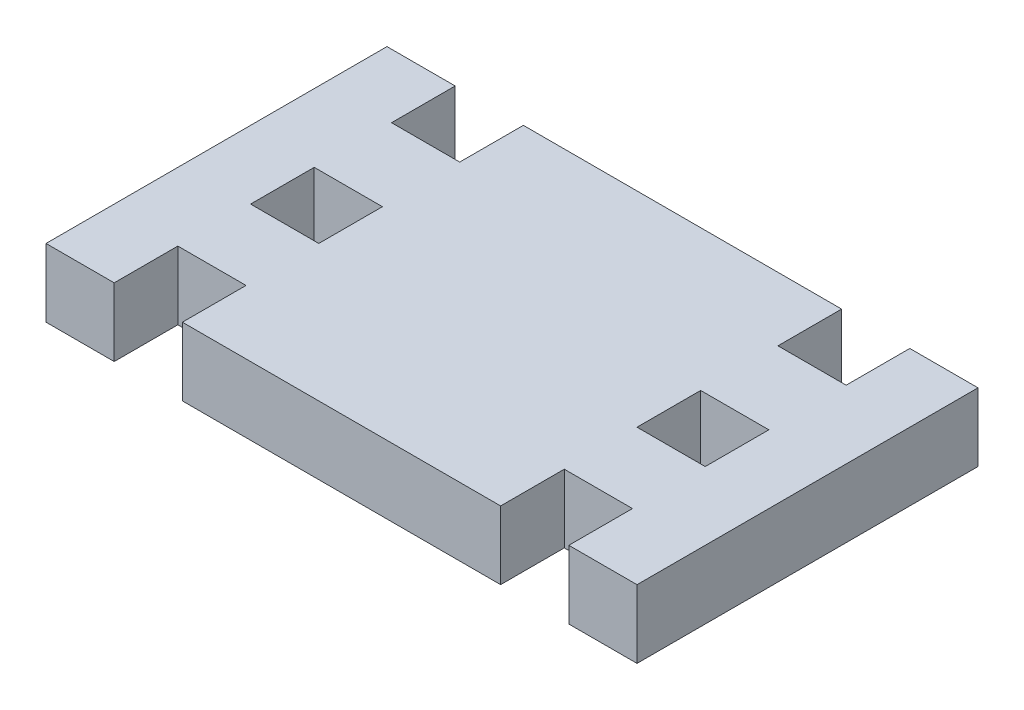
ISO-10303-21;
HEADER;
FILE_DESCRIPTION(('STEP AP214'),'2;1');
FILE_NAME('part.step','',(''),(''),'','','');
FILE_SCHEMA(('AUTOMOTIVE_DESIGN { 1 0 10303 214 1 1 1 1 }'));
ENDSEC;
DATA;
#1=APPLICATION_CONTEXT('core data for automotive mechanical design processes');
#2=APPLICATION_PROTOCOL_DEFINITION('international standard','automotive_design',2000,#1);
#3=PRODUCT_CONTEXT('',#1,'mechanical');
#4=PRODUCT('Part','Part','',(#3));
#5=PRODUCT_RELATED_PRODUCT_CATEGORY('part','',(#4));
#6=PRODUCT_DEFINITION_FORMATION('','',#4);
#7=PRODUCT_DEFINITION_CONTEXT('part definition',#1,'design');
#8=PRODUCT_DEFINITION('design','',#6,#7);
#9=PRODUCT_DEFINITION_SHAPE('','',#8);
#10=(LENGTH_UNIT() NAMED_UNIT(*) SI_UNIT(.MILLI.,.METRE.));
#11=(NAMED_UNIT(*) PLANE_ANGLE_UNIT() SI_UNIT($,.RADIAN.));
#12=(NAMED_UNIT(*) SI_UNIT($,.STERADIAN.) SOLID_ANGLE_UNIT());
#13=UNCERTAINTY_MEASURE_WITH_UNIT(LENGTH_MEASURE(1.E-05),#10,'distance_accuracy_value','');
#14=(GEOMETRIC_REPRESENTATION_CONTEXT(3) GLOBAL_UNCERTAINTY_ASSIGNED_CONTEXT((#13)) GLOBAL_UNIT_ASSIGNED_CONTEXT((#10,
#11,#12)) REPRESENTATION_CONTEXT('',''));
#15=CARTESIAN_POINT('',(0.,0.,0.));
#16=DIRECTION('',(0.,0.,1.));
#17=DIRECTION('',(1.,0.,0.));
#18=AXIS2_PLACEMENT_3D('',#15,#16,#17);
#19=CARTESIAN_POINT('',(0.,3.,0.));
#20=DIRECTION('',(0.,1.,0.));
#21=DIRECTION('',(0.,0.,1.));
#22=AXIS2_PLACEMENT_3D('',#19,#20,#21);
#23=PLANE('',#22);
#24=DIRECTION('',(0.,0.,-1.));
#25=VECTOR('',#24,1.);
#26=CARTESIAN_POINT('',(-10.,3.,6.97762481767399));
#27=LINE('',#26,#25);
#28=CARTESIAN_POINT('',(-10.,3.,9.77762481767399));
#29=VERTEX_POINT('',#28);
#30=CARTESIAN_POINT('',(-10.,3.,6.97762481767399));
#31=VERTEX_POINT('',#30);
#32=EDGE_CURVE('E316',#29,#31,#27,.T.);
#33=ORIENTED_EDGE('',*,*,#32,.T.);
#34=DIRECTION('',(1.,0.,0.));
#35=VECTOR('',#34,1.);
#36=CARTESIAN_POINT('',(-10.,3.,6.97762481767399));
#37=LINE('',#36,#35);
#38=CARTESIAN_POINT('',(-7.,3.,6.97762481767399));
#39=VERTEX_POINT('',#38);
#40=EDGE_CURVE('E320',#31,#39,#37,.T.);
#41=ORIENTED_EDGE('',*,*,#40,.T.);
#42=DIRECTION('',(0.,0.,1.));
#43=VECTOR('',#42,1.);
#44=CARTESIAN_POINT('',(-7.,3.,6.97762481767399));
#45=LINE('',#44,#43);
#46=CARTESIAN_POINT('',(-7.,3.,9.77762481767399));
#47=VERTEX_POINT('',#46);
#48=EDGE_CURVE('E324',#39,#47,#45,.T.);
#49=ORIENTED_EDGE('',*,*,#48,.T.);
#50=DIRECTION('',(1.,0.,0.));
#51=VECTOR('',#50,1.);
#52=CARTESIAN_POINT('',(-7.,3.,9.77762481767399));
#53=LINE('',#52,#51);
#54=CARTESIAN_POINT('',(7.,3.,9.77762481767398));
#55=VERTEX_POINT('',#54);
#56=EDGE_CURVE('E327',#47,#55,#53,.T.);
#57=ORIENTED_EDGE('',*,*,#56,.T.);
#58=DIRECTION('',(0.,0.,-1.));
#59=VECTOR('',#58,1.);
#60=CARTESIAN_POINT('',(7.,3.,6.97762481767398));
#61=LINE('',#60,#59);
#62=CARTESIAN_POINT('',(7.,3.,6.97762481767398));
#63=VERTEX_POINT('',#62);
#64=EDGE_CURVE('E330',#55,#63,#61,.T.);
#65=ORIENTED_EDGE('',*,*,#64,.T.);
#66=DIRECTION('',(1.,0.,0.));
#67=VECTOR('',#66,1.);
#68=CARTESIAN_POINT('',(10.,3.,6.97762481767398));
#69=LINE('',#68,#67);
#70=CARTESIAN_POINT('',(10.,3.,6.97762481767398));
#71=VERTEX_POINT('',#70);
#72=EDGE_CURVE('E333',#63,#71,#69,.T.);
#73=ORIENTED_EDGE('',*,*,#72,.T.);
#74=DIRECTION('',(0.,0.,1.));
#75=VECTOR('',#74,1.);
#76=CARTESIAN_POINT('',(10.,3.,6.97762481767398));
#77=LINE('',#76,#75);
#78=CARTESIAN_POINT('',(10.,3.,9.77762481767399));
#79=VERTEX_POINT('',#78);
#80=EDGE_CURVE('E336',#71,#79,#77,.T.);
#81=ORIENTED_EDGE('',*,*,#80,.T.);
#82=DIRECTION('',(1.,0.,0.));
#83=VECTOR('',#82,1.);
#84=CARTESIAN_POINT('',(10.,3.,9.77762481767399));
#85=LINE('',#84,#83);
#86=CARTESIAN_POINT('',(13.,3.,9.77762481767399));
#87=VERTEX_POINT('',#86);
#88=EDGE_CURVE('E339',#79,#87,#85,.T.);
#89=ORIENTED_EDGE('',*,*,#88,.T.);
#90=DIRECTION('',(0.,0.,-1.));
#91=VECTOR('',#90,1.);
#92=CARTESIAN_POINT('',(13.,3.,-5.22237518232601));
#93=LINE('',#92,#91);
#94=CARTESIAN_POINT('',(13.,3.,-5.22237518232601));
#95=VERTEX_POINT('',#94);
#96=EDGE_CURVE('E342',#87,#95,#93,.T.);
#97=ORIENTED_EDGE('',*,*,#96,.T.);
#98=DIRECTION('',(-1.,0.,0.));
#99=VECTOR('',#98,1.);
#100=CARTESIAN_POINT('',(10.,3.,-5.22237518232601));
#101=LINE('',#100,#99);
#102=CARTESIAN_POINT('',(10.,3.,-5.22237518232601));
#103=VERTEX_POINT('',#102);
#104=EDGE_CURVE('E345',#95,#103,#101,.T.);
#105=ORIENTED_EDGE('',*,*,#104,.T.);
#106=DIRECTION('',(0.,0.,1.));
#107=VECTOR('',#106,1.);
#108=CARTESIAN_POINT('',(10.,3.,-5.22237518232601));
#109=LINE('',#108,#107);
#110=CARTESIAN_POINT('',(10.,3.,-2.42237518232601));
#111=VERTEX_POINT('',#110);
#112=EDGE_CURVE('E348',#103,#111,#109,.T.);
#113=ORIENTED_EDGE('',*,*,#112,.T.);
#114=DIRECTION('',(-1.,0.,0.));
#115=VECTOR('',#114,1.);
#116=CARTESIAN_POINT('',(10.,3.,-2.42237518232601));
#117=LINE('',#116,#115);
#118=CARTESIAN_POINT('',(6.99999999999999,3.,-2.42237518232601));
#119=VERTEX_POINT('',#118);
#120=EDGE_CURVE('E351',#111,#119,#117,.T.);
#121=ORIENTED_EDGE('',*,*,#120,.T.);
#122=DIRECTION('',(0.,0.,-1.));
#123=VECTOR('',#122,1.);
#124=CARTESIAN_POINT('',(6.99999999999999,3.,-5.22237518232601));
#125=LINE('',#124,#123);
#126=CARTESIAN_POINT('',(6.99999999999999,3.,-5.22237518232601));
#127=VERTEX_POINT('',#126);
#128=EDGE_CURVE('E354',#119,#127,#125,.T.);
#129=ORIENTED_EDGE('',*,*,#128,.T.);
#130=DIRECTION('',(-1.,0.,0.));
#131=VECTOR('',#130,1.);
#132=CARTESIAN_POINT('',(-6.99999999999999,3.,-5.22237518232601));
#133=LINE('',#132,#131);
#134=CARTESIAN_POINT('',(-6.99999999999999,3.,-5.22237518232601));
#135=VERTEX_POINT('',#134);
#136=EDGE_CURVE('E357',#127,#135,#133,.T.);
#137=ORIENTED_EDGE('',*,*,#136,.T.);
#138=DIRECTION('',(0.,0.,1.));
#139=VECTOR('',#138,1.);
#140=CARTESIAN_POINT('',(-6.99999999999999,3.,-5.22237518232601));
#141=LINE('',#140,#139);
#142=CARTESIAN_POINT('',(-6.99999999999999,3.,-2.42237518232601));
#143=VERTEX_POINT('',#142);
#144=EDGE_CURVE('E360',#135,#143,#141,.T.);
#145=ORIENTED_EDGE('',*,*,#144,.T.);
#146=DIRECTION('',(-1.,0.,0.));
#147=VECTOR('',#146,1.);
#148=CARTESIAN_POINT('',(-10.,3.,-2.42237518232601));
#149=LINE('',#148,#147);
#150=CARTESIAN_POINT('',(-10.,3.,-2.42237518232601));
#151=VERTEX_POINT('',#150);
#152=EDGE_CURVE('E363',#143,#151,#149,.T.);
#153=ORIENTED_EDGE('',*,*,#152,.T.);
#154=DIRECTION('',(0.,0.,-1.));
#155=VECTOR('',#154,1.);
#156=CARTESIAN_POINT('',(-10.,3.,-5.22237518232601));
#157=LINE('',#156,#155);
#158=CARTESIAN_POINT('',(-10.,3.,-5.22237518232601));
#159=VERTEX_POINT('',#158);
#160=EDGE_CURVE('E366',#151,#159,#157,.T.);
#161=ORIENTED_EDGE('',*,*,#160,.T.);
#162=DIRECTION('',(-1.,0.,0.));
#163=VECTOR('',#162,1.);
#164=CARTESIAN_POINT('',(-13.,3.,-5.22237518232601));
#165=LINE('',#164,#163);
#166=CARTESIAN_POINT('',(-13.,3.,-5.22237518232601));
#167=VERTEX_POINT('',#166);
#168=EDGE_CURVE('E369',#159,#167,#165,.T.);
#169=ORIENTED_EDGE('',*,*,#168,.T.);
#170=DIRECTION('',(0.,0.,1.));
#171=VECTOR('',#170,1.);
#172=CARTESIAN_POINT('',(-13.,3.,-5.22237518232601));
#173=LINE('',#172,#171);
#174=CARTESIAN_POINT('',(-13.,3.,9.77762481767399));
#175=VERTEX_POINT('',#174);
#176=EDGE_CURVE('E372',#167,#175,#173,.T.);
#177=ORIENTED_EDGE('',*,*,#176,.T.);
#178=DIRECTION('',(1.,0.,0.));
#179=VECTOR('',#178,1.);
#180=CARTESIAN_POINT('',(-13.,3.,9.77762481767399));
#181=LINE('',#180,#179);
#182=EDGE_CURVE('E375',#175,#29,#181,.T.);
#183=ORIENTED_EDGE('',*,*,#182,.T.);
#184=EDGE_LOOP('',(#33,#41,#49,#57,#65,#73,#81,#89,#97,#105,#113,#121,#129,#137,#145,#153,#161,
#169,#177,#183));
#185=FACE_BOUND('',#184,.T.);
#186=DIRECTION('',(1.,0.,0.));
#187=VECTOR('',#186,1.);
#188=CARTESIAN_POINT('',(-10.,3.,3.77762481767399));
#189=LINE('',#188,#187);
#190=CARTESIAN_POINT('',(-10.,3.,3.77762481767399));
#191=VERTEX_POINT('',#190);
#192=CARTESIAN_POINT('',(-7.,3.,3.77762481767399));
#193=VERTEX_POINT('',#192);
#194=EDGE_CURVE('E276',#191,#193,#189,.T.);
#195=ORIENTED_EDGE('',*,*,#194,.F.);
#196=DIRECTION('',(0.,0.,1.));
#197=VECTOR('',#196,1.);
#198=CARTESIAN_POINT('',(-10.,3.,0.977624817673989));
#199=LINE('',#198,#197);
#200=CARTESIAN_POINT('',(-10.,3.,0.977624817673989));
#201=VERTEX_POINT('',#200);
#202=EDGE_CURVE('E273',#201,#191,#199,.T.);
#203=ORIENTED_EDGE('',*,*,#202,.F.);
#204=DIRECTION('',(-1.,0.,0.));
#205=VECTOR('',#204,1.);
#206=CARTESIAN_POINT('',(-10.,3.,0.977624817673989));
#207=LINE('',#206,#205);
#208=CARTESIAN_POINT('',(-7.,3.,0.977624817673989));
#209=VERTEX_POINT('',#208);
#210=EDGE_CURVE('E284',#209,#201,#207,.T.);
#211=ORIENTED_EDGE('',*,*,#210,.F.);
#212=DIRECTION('',(0.,0.,-1.));
#213=VECTOR('',#212,1.);
#214=CARTESIAN_POINT('',(-7.,3.,0.977624817673989));
#215=LINE('',#214,#213);
#216=EDGE_CURVE('E280',#193,#209,#215,.T.);
#217=ORIENTED_EDGE('',*,*,#216,.F.);
#218=EDGE_LOOP('',(#195,#203,#211,#217));
#219=FACE_BOUND('',#218,.T.);
#220=DIRECTION('',(0.,0.,1.));
#221=VECTOR('',#220,1.);
#222=CARTESIAN_POINT('',(7.,3.,0.977624817673987));
#223=LINE('',#222,#221);
#224=CARTESIAN_POINT('',(7.,3.,0.977624817673987));
#225=VERTEX_POINT('',#224);
#226=CARTESIAN_POINT('',(7.,3.,3.77762481767399));
#227=VERTEX_POINT('',#226);
#228=EDGE_CURVE('E234',#225,#227,#223,.T.);
#229=ORIENTED_EDGE('',*,*,#228,.F.);
#230=DIRECTION('',(-1.,0.,0.));
#231=VECTOR('',#230,1.);
#232=CARTESIAN_POINT('',(10.,3.,0.977624817673987));
#233=LINE('',#232,#231);
#234=CARTESIAN_POINT('',(10.,3.,0.977624817673987));
#235=VERTEX_POINT('',#234);
#236=EDGE_CURVE('E225',#235,#225,#233,.T.);
#237=ORIENTED_EDGE('',*,*,#236,.F.);
#238=DIRECTION('',(0.,0.,-1.));
#239=VECTOR('',#238,1.);
#240=CARTESIAN_POINT('',(10.,3.,0.977624817673987));
#241=LINE('',#240,#239);
#242=CARTESIAN_POINT('',(10.,3.,3.77762481767399));
#243=VERTEX_POINT('',#242);
#244=EDGE_CURVE('E251',#243,#235,#241,.T.);
#245=ORIENTED_EDGE('',*,*,#244,.F.);
#246=DIRECTION('',(1.,0.,0.));
#247=VECTOR('',#246,1.);
#248=CARTESIAN_POINT('',(10.,3.,3.77762481767399));
#249=LINE('',#248,#247);
#250=EDGE_CURVE('E247',#227,#243,#249,.T.);
#251=ORIENTED_EDGE('',*,*,#250,.F.);
#252=EDGE_LOOP('',(#229,#237,#245,#251));
#253=FACE_BOUND('',#252,.T.);
#254=ADVANCED_FACE('F39',(#185,#219,#253),#23,.T.);
#255=CARTESIAN_POINT('',(0.,0.,0.));
#256=DIRECTION('',(0.,1.,0.));
#257=DIRECTION('',(0.,0.,1.));
#258=AXIS2_PLACEMENT_3D('',#255,#256,#257);
#259=PLANE('',#258);
#260=DIRECTION('',(0.,0.,1.));
#261=VECTOR('',#260,1.);
#262=CARTESIAN_POINT('',(-10.,0.,0.977624817673989));
#263=LINE('',#262,#261);
#264=CARTESIAN_POINT('',(-10.,0.,0.977624817673989));
#265=VERTEX_POINT('',#264);
#266=CARTESIAN_POINT('',(-10.,0.,3.77762481767399));
#267=VERTEX_POINT('',#266);
#268=EDGE_CURVE('E243',#265,#267,#263,.T.);
#269=ORIENTED_EDGE('',*,*,#268,.T.);
#270=DIRECTION('',(1.,0.,0.));
#271=VECTOR('',#270,1.);
#272=CARTESIAN_POINT('',(-10.,0.,3.77762481767399));
#273=LINE('',#272,#271);
#274=CARTESIAN_POINT('',(-7.,0.,3.77762481767399));
#275=VERTEX_POINT('',#274);
#276=EDGE_CURVE('E291',#267,#275,#273,.T.);
#277=ORIENTED_EDGE('',*,*,#276,.T.);
#278=DIRECTION('',(0.,0.,-1.));
#279=VECTOR('',#278,1.);
#280=CARTESIAN_POINT('',(-7.,0.,0.977624817673989));
#281=LINE('',#280,#279);
#282=CARTESIAN_POINT('',(-7.,0.,0.977624817673989));
#283=VERTEX_POINT('',#282);
#284=EDGE_CURVE('E295',#275,#283,#281,.T.);
#285=ORIENTED_EDGE('',*,*,#284,.T.);
#286=DIRECTION('',(-1.,0.,0.));
#287=VECTOR('',#286,1.);
#288=CARTESIAN_POINT('',(-10.,0.,0.977624817673989));
#289=LINE('',#288,#287);
#290=EDGE_CURVE('E277',#283,#265,#289,.T.);
#291=ORIENTED_EDGE('',*,*,#290,.T.);
#292=EDGE_LOOP('',(#269,#277,#285,#291));
#293=FACE_BOUND('',#292,.T.);
#294=DIRECTION('',(0.,0.,-1.));
#295=VECTOR('',#294,1.);
#296=CARTESIAN_POINT('',(-10.,0.,6.97762481767399));
#297=LINE('',#296,#295);
#298=CARTESIAN_POINT('',(-10.,0.,9.77762481767399));
#299=VERTEX_POINT('',#298);
#300=CARTESIAN_POINT('',(-10.,0.,6.97762481767399));
#301=VERTEX_POINT('',#300);
#302=EDGE_CURVE('E315',#299,#301,#297,.T.);
#303=ORIENTED_EDGE('',*,*,#302,.F.);
#304=DIRECTION('',(1.,0.,0.));
#305=VECTOR('',#304,1.);
#306=CARTESIAN_POINT('',(-13.,0.,9.77762481767399));
#307=LINE('',#306,#305);
#308=CARTESIAN_POINT('',(-13.,0.,9.77762481767399));
#309=VERTEX_POINT('',#308);
#310=EDGE_CURVE('E321',#309,#299,#307,.T.);
#311=ORIENTED_EDGE('',*,*,#310,.F.);
#312=DIRECTION('',(0.,0.,1.));
#313=VECTOR('',#312,1.);
#314=CARTESIAN_POINT('',(-13.,0.,-5.22237518232601));
#315=LINE('',#314,#313);
#316=CARTESIAN_POINT('',(-13.,0.,-5.22237518232601));
#317=VERTEX_POINT('',#316);
#318=EDGE_CURVE('E433',#317,#309,#315,.T.);
#319=ORIENTED_EDGE('',*,*,#318,.F.);
#320=DIRECTION('',(-1.,0.,0.));
#321=VECTOR('',#320,1.);
#322=CARTESIAN_POINT('',(-13.,0.,-5.22237518232601));
#323=LINE('',#322,#321);
#324=CARTESIAN_POINT('',(-10.,0.,-5.22237518232601));
#325=VERTEX_POINT('',#324);
#326=EDGE_CURVE('E430',#325,#317,#323,.T.);
#327=ORIENTED_EDGE('',*,*,#326,.F.);
#328=DIRECTION('',(0.,0.,-1.));
#329=VECTOR('',#328,1.);
#330=CARTESIAN_POINT('',(-10.,0.,-5.22237518232601));
#331=LINE('',#330,#329);
#332=CARTESIAN_POINT('',(-10.,0.,-2.42237518232601));
#333=VERTEX_POINT('',#332);
#334=EDGE_CURVE('E427',#333,#325,#331,.T.);
#335=ORIENTED_EDGE('',*,*,#334,.F.);
#336=DIRECTION('',(-1.,0.,0.));
#337=VECTOR('',#336,1.);
#338=CARTESIAN_POINT('',(-10.,0.,-2.42237518232601));
#339=LINE('',#338,#337);
#340=CARTESIAN_POINT('',(-6.99999999999999,0.,-2.42237518232601));
#341=VERTEX_POINT('',#340);
#342=EDGE_CURVE('E424',#341,#333,#339,.T.);
#343=ORIENTED_EDGE('',*,*,#342,.F.);
#344=DIRECTION('',(0.,0.,1.));
#345=VECTOR('',#344,1.);
#346=CARTESIAN_POINT('',(-6.99999999999999,0.,-5.22237518232601));
#347=LINE('',#346,#345);
#348=CARTESIAN_POINT('',(-6.99999999999999,0.,-5.22237518232601));
#349=VERTEX_POINT('',#348);
#350=EDGE_CURVE('E421',#349,#341,#347,.T.);
#351=ORIENTED_EDGE('',*,*,#350,.F.);
#352=DIRECTION('',(-1.,0.,0.));
#353=VECTOR('',#352,1.);
#354=CARTESIAN_POINT('',(-6.99999999999999,0.,-5.22237518232601));
#355=LINE('',#354,#353);
#356=CARTESIAN_POINT('',(6.99999999999999,0.,-5.22237518232601));
#357=VERTEX_POINT('',#356);
#358=EDGE_CURVE('E418',#357,#349,#355,.T.);
#359=ORIENTED_EDGE('',*,*,#358,.F.);
#360=DIRECTION('',(0.,0.,-1.));
#361=VECTOR('',#360,1.);
#362=CARTESIAN_POINT('',(6.99999999999999,0.,-5.22237518232601));
#363=LINE('',#362,#361);
#364=CARTESIAN_POINT('',(6.99999999999999,0.,-2.42237518232601));
#365=VERTEX_POINT('',#364);
#366=EDGE_CURVE('E415',#365,#357,#363,.T.);
#367=ORIENTED_EDGE('',*,*,#366,.F.);
#368=DIRECTION('',(-1.,0.,0.));
#369=VECTOR('',#368,1.);
#370=CARTESIAN_POINT('',(10.,0.,-2.42237518232601));
#371=LINE('',#370,#369);
#372=CARTESIAN_POINT('',(10.,0.,-2.42237518232601));
#373=VERTEX_POINT('',#372);
#374=EDGE_CURVE('E412',#373,#365,#371,.T.);
#375=ORIENTED_EDGE('',*,*,#374,.F.);
#376=DIRECTION('',(0.,0.,1.));
#377=VECTOR('',#376,1.);
#378=CARTESIAN_POINT('',(10.,0.,-5.22237518232601));
#379=LINE('',#378,#377);
#380=CARTESIAN_POINT('',(10.,0.,-5.22237518232601));
#381=VERTEX_POINT('',#380);
#382=EDGE_CURVE('E409',#381,#373,#379,.T.);
#383=ORIENTED_EDGE('',*,*,#382,.F.);
#384=DIRECTION('',(-1.,0.,0.));
#385=VECTOR('',#384,1.);
#386=CARTESIAN_POINT('',(10.,0.,-5.22237518232601));
#387=LINE('',#386,#385);
#388=CARTESIAN_POINT('',(13.,0.,-5.22237518232601));
#389=VERTEX_POINT('',#388);
#390=EDGE_CURVE('E406',#389,#381,#387,.T.);
#391=ORIENTED_EDGE('',*,*,#390,.F.);
#392=DIRECTION('',(0.,0.,-1.));
#393=VECTOR('',#392,1.);
#394=CARTESIAN_POINT('',(13.,0.,-5.22237518232601));
#395=LINE('',#394,#393);
#396=CARTESIAN_POINT('',(13.,0.,9.77762481767399));
#397=VERTEX_POINT('',#396);
#398=EDGE_CURVE('E403',#397,#389,#395,.T.);
#399=ORIENTED_EDGE('',*,*,#398,.F.);
#400=DIRECTION('',(1.,0.,0.));
#401=VECTOR('',#400,1.);
#402=CARTESIAN_POINT('',(10.,0.,9.77762481767399));
#403=LINE('',#402,#401);
#404=CARTESIAN_POINT('',(10.,0.,9.77762481767399));
#405=VERTEX_POINT('',#404);
#406=EDGE_CURVE('E400',#405,#397,#403,.T.);
#407=ORIENTED_EDGE('',*,*,#406,.F.);
#408=DIRECTION('',(0.,0.,1.));
#409=VECTOR('',#408,1.);
#410=CARTESIAN_POINT('',(10.,0.,6.97762481767398));
#411=LINE('',#410,#409);
#412=CARTESIAN_POINT('',(10.,0.,6.97762481767398));
#413=VERTEX_POINT('',#412);
#414=EDGE_CURVE('E397',#413,#405,#411,.T.);
#415=ORIENTED_EDGE('',*,*,#414,.F.);
#416=DIRECTION('',(1.,0.,0.));
#417=VECTOR('',#416,1.);
#418=CARTESIAN_POINT('',(10.,0.,6.97762481767398));
#419=LINE('',#418,#417);
#420=CARTESIAN_POINT('',(7.,0.,6.97762481767398));
#421=VERTEX_POINT('',#420);
#422=EDGE_CURVE('E394',#421,#413,#419,.T.);
#423=ORIENTED_EDGE('',*,*,#422,.F.);
#424=DIRECTION('',(0.,0.,-1.));
#425=VECTOR('',#424,1.);
#426=CARTESIAN_POINT('',(7.,0.,6.97762481767398));
#427=LINE('',#426,#425);
#428=CARTESIAN_POINT('',(7.,0.,9.77762481767398));
#429=VERTEX_POINT('',#428);
#430=EDGE_CURVE('E391',#429,#421,#427,.T.);
#431=ORIENTED_EDGE('',*,*,#430,.F.);
#432=DIRECTION('',(1.,0.,0.));
#433=VECTOR('',#432,1.);
#434=CARTESIAN_POINT('',(-7.,0.,9.77762481767399));
#435=LINE('',#434,#433);
#436=CARTESIAN_POINT('',(-7.,0.,9.77762481767399));
#437=VERTEX_POINT('',#436);
#438=EDGE_CURVE('E388',#437,#429,#435,.T.);
#439=ORIENTED_EDGE('',*,*,#438,.F.);
#440=DIRECTION('',(0.,0.,1.));
#441=VECTOR('',#440,1.);
#442=CARTESIAN_POINT('',(-7.,0.,6.97762481767399));
#443=LINE('',#442,#441);
#444=CARTESIAN_POINT('',(-7.,0.,6.97762481767399));
#445=VERTEX_POINT('',#444);
#446=EDGE_CURVE('E385',#445,#437,#443,.T.);
#447=ORIENTED_EDGE('',*,*,#446,.F.);
#448=DIRECTION('',(1.,0.,0.));
#449=VECTOR('',#448,1.);
#450=CARTESIAN_POINT('',(-10.,0.,6.97762481767399));
#451=LINE('',#450,#449);
#452=EDGE_CURVE('E382',#301,#445,#451,.T.);
#453=ORIENTED_EDGE('',*,*,#452,.F.);
#454=EDGE_LOOP('',(#303,#311,#319,#327,#335,#343,#351,#359,#367,#375,#383,#391,#399,#407,#415,
#423,#431,#439,#447,#453));
#455=FACE_BOUND('',#454,.T.);
#456=DIRECTION('',(-1.,0.,0.));
#457=VECTOR('',#456,1.);
#458=CARTESIAN_POINT('',(10.,0.,0.977624817673987));
#459=LINE('',#458,#457);
#460=CARTESIAN_POINT('',(10.,0.,0.977624817673987));
#461=VERTEX_POINT('',#460);
#462=CARTESIAN_POINT('',(7.,0.,0.977624817673987));
#463=VERTEX_POINT('',#462);
#464=EDGE_CURVE('E63',#461,#463,#459,.T.);
#465=ORIENTED_EDGE('',*,*,#464,.T.);
#466=DIRECTION('',(0.,0.,1.));
#467=VECTOR('',#466,1.);
#468=CARTESIAN_POINT('',(7.,0.,0.977624817673987));
#469=LINE('',#468,#467);
#470=CARTESIAN_POINT('',(7.,0.,3.77762481767399));
#471=VERTEX_POINT('',#470);
#472=EDGE_CURVE('E241',#463,#471,#469,.T.);
#473=ORIENTED_EDGE('',*,*,#472,.T.);
#474=DIRECTION('',(1.,0.,0.));
#475=VECTOR('',#474,1.);
#476=CARTESIAN_POINT('',(10.,0.,3.77762481767399));
#477=LINE('',#476,#475);
#478=CARTESIAN_POINT('',(10.,0.,3.77762481767399));
#479=VERTEX_POINT('',#478);
#480=EDGE_CURVE('E260',#471,#479,#477,.T.);
#481=ORIENTED_EDGE('',*,*,#480,.T.);
#482=DIRECTION('',(0.,0.,-1.));
#483=VECTOR('',#482,1.);
#484=CARTESIAN_POINT('',(10.,0.,0.977624817673987));
#485=LINE('',#484,#483);
#486=EDGE_CURVE('E235',#479,#461,#485,.T.);
#487=ORIENTED_EDGE('',*,*,#486,.T.);
#488=EDGE_LOOP('',(#465,#473,#481,#487));
#489=FACE_BOUND('',#488,.T.);
#490=ADVANCED_FACE('F520',(#293,#455,#489),#259,.F.);
#491=CARTESIAN_POINT('',(-10.,3.,6.97762481767399));
#492=DIRECTION('',(-1.,0.,0.));
#493=DIRECTION('',(0.,0.,1.));
#494=AXIS2_PLACEMENT_3D('',#491,#492,#493);
#495=PLANE('',#494);
#496=ORIENTED_EDGE('',*,*,#302,.T.);
#497=DIRECTION('',(0.,-1.,0.));
#498=VECTOR('',#497,1.);
#499=CARTESIAN_POINT('',(-10.,3.,6.97762481767399));
#500=LINE('',#499,#498);
#501=EDGE_CURVE('E11',#31,#301,#500,.T.);
#502=ORIENTED_EDGE('',*,*,#501,.F.);
#503=ORIENTED_EDGE('',*,*,#32,.F.);
#504=DIRECTION('',(0.,-1.,0.));
#505=VECTOR('',#504,1.);
#506=CARTESIAN_POINT('',(-10.,3.,9.77762481767399));
#507=LINE('',#506,#505);
#508=EDGE_CURVE('E378',#29,#299,#507,.T.);
#509=ORIENTED_EDGE('',*,*,#508,.T.);
#510=EDGE_LOOP('',(#496,#502,#503,#509));
#511=FACE_BOUND('',#510,.T.);
#512=ADVANCED_FACE('F41',(#511),#495,.F.);
#513=CARTESIAN_POINT('',(-10.,3.,6.97762481767399));
#514=DIRECTION('',(0.,0.,-1.));
#515=DIRECTION('',(-1.,0.,0.));
#516=AXIS2_PLACEMENT_3D('',#513,#514,#515);
#517=PLANE('',#516);
#518=ORIENTED_EDGE('',*,*,#452,.T.);
#519=DIRECTION('',(0.,-1.,0.));
#520=VECTOR('',#519,1.);
#521=CARTESIAN_POINT('',(-7.,3.,6.97762481767399));
#522=LINE('',#521,#520);
#523=EDGE_CURVE('E48',#39,#445,#522,.T.);
#524=ORIENTED_EDGE('',*,*,#523,.F.);
#525=ORIENTED_EDGE('',*,*,#40,.F.);
#526=ORIENTED_EDGE('',*,*,#501,.T.);
#527=EDGE_LOOP('',(#518,#524,#525,#526));
#528=FACE_BOUND('',#527,.T.);
#529=ADVANCED_FACE('F538',(#528),#517,.F.);
#530=CARTESIAN_POINT('',(-7.,3.,6.97762481767399));
#531=DIRECTION('',(1.,0.,0.));
#532=DIRECTION('',(0.,0.,-1.));
#533=AXIS2_PLACEMENT_3D('',#530,#531,#532);
#534=PLANE('',#533);
#535=ORIENTED_EDGE('',*,*,#446,.T.);
#536=DIRECTION('',(0.,-1.,0.));
#537=VECTOR('',#536,1.);
#538=CARTESIAN_POINT('',(-7.,3.,9.77762481767399));
#539=LINE('',#538,#537);
#540=EDGE_CURVE('E505',#47,#437,#539,.T.);
#541=ORIENTED_EDGE('',*,*,#540,.F.);
#542=ORIENTED_EDGE('',*,*,#48,.F.);
#543=ORIENTED_EDGE('',*,*,#523,.T.);
#544=EDGE_LOOP('',(#535,#541,#542,#543));
#545=FACE_BOUND('',#544,.T.);
#546=ADVANCED_FACE('F514',(#545),#534,.F.);
#547=CARTESIAN_POINT('',(-7.,3.,9.77762481767399));
#548=DIRECTION('',(0.,0.,-1.));
#549=DIRECTION('',(-1.,0.,0.));
#550=AXIS2_PLACEMENT_3D('',#547,#548,#549);
#551=PLANE('',#550);
#552=ORIENTED_EDGE('',*,*,#438,.T.);
#553=DIRECTION('',(0.,-1.,0.));
#554=VECTOR('',#553,1.);
#555=CARTESIAN_POINT('',(7.,3.,9.77762481767398));
#556=LINE('',#555,#554);
#557=EDGE_CURVE('E501',#55,#429,#556,.T.);
#558=ORIENTED_EDGE('',*,*,#557,.F.);
#559=ORIENTED_EDGE('',*,*,#56,.F.);
#560=ORIENTED_EDGE('',*,*,#540,.T.);
#561=EDGE_LOOP('',(#552,#558,#559,#560));
#562=FACE_BOUND('',#561,.T.);
#563=ADVANCED_FACE('F526',(#562),#551,.F.);
#564=CARTESIAN_POINT('',(7.,3.,6.97762481767398));
#565=DIRECTION('',(-1.,0.,0.));
#566=DIRECTION('',(0.,0.,1.));
#567=AXIS2_PLACEMENT_3D('',#564,#565,#566);
#568=PLANE('',#567);
#569=ORIENTED_EDGE('',*,*,#430,.T.);
#570=DIRECTION('',(0.,-1.,0.));
#571=VECTOR('',#570,1.);
#572=CARTESIAN_POINT('',(7.,3.,6.97762481767398));
#573=LINE('',#572,#571);
#574=EDGE_CURVE('E497',#63,#421,#573,.T.);
#575=ORIENTED_EDGE('',*,*,#574,.F.);
#576=ORIENTED_EDGE('',*,*,#64,.F.);
#577=ORIENTED_EDGE('',*,*,#557,.T.);
#578=EDGE_LOOP('',(#569,#575,#576,#577));
#579=FACE_BOUND('',#578,.T.);
#580=ADVANCED_FACE('F530',(#579),#568,.F.);
#581=CARTESIAN_POINT('',(10.,3.,6.97762481767398));
#582=DIRECTION('',(0.,0.,-1.));
#583=DIRECTION('',(-1.,0.,0.));
#584=AXIS2_PLACEMENT_3D('',#581,#582,#583);
#585=PLANE('',#584);
#586=ORIENTED_EDGE('',*,*,#422,.T.);
#587=DIRECTION('',(0.,-1.,0.));
#588=VECTOR('',#587,1.);
#589=CARTESIAN_POINT('',(10.,3.,6.97762481767398));
#590=LINE('',#589,#588);
#591=EDGE_CURVE('E493',#71,#413,#590,.T.);
#592=ORIENTED_EDGE('',*,*,#591,.F.);
#593=ORIENTED_EDGE('',*,*,#72,.F.);
#594=ORIENTED_EDGE('',*,*,#574,.T.);
#595=EDGE_LOOP('',(#586,#592,#593,#594));
#596=FACE_BOUND('',#595,.T.);
#597=ADVANCED_FACE('F611',(#596),#585,.F.);
#598=CARTESIAN_POINT('',(10.,3.,6.97762481767398));
#599=DIRECTION('',(1.,0.,0.));
#600=DIRECTION('',(0.,0.,-1.));
#601=AXIS2_PLACEMENT_3D('',#598,#599,#600);
#602=PLANE('',#601);
#603=ORIENTED_EDGE('',*,*,#414,.T.);
#604=DIRECTION('',(0.,-1.,0.));
#605=VECTOR('',#604,1.);
#606=CARTESIAN_POINT('',(10.,3.,9.77762481767399));
#607=LINE('',#606,#605);
#608=EDGE_CURVE('E489',#79,#405,#607,.T.);
#609=ORIENTED_EDGE('',*,*,#608,.F.);
#610=ORIENTED_EDGE('',*,*,#80,.F.);
#611=ORIENTED_EDGE('',*,*,#591,.T.);
#612=EDGE_LOOP('',(#603,#609,#610,#611));
#613=FACE_BOUND('',#612,.T.);
#614=ADVANCED_FACE('F609',(#613),#602,.F.);
#615=CARTESIAN_POINT('',(10.,3.,9.77762481767399));
#616=DIRECTION('',(0.,0.,-1.));
#617=DIRECTION('',(-1.,0.,0.));
#618=AXIS2_PLACEMENT_3D('',#615,#616,#617);
#619=PLANE('',#618);
#620=ORIENTED_EDGE('',*,*,#406,.T.);
#621=DIRECTION('',(0.,-1.,0.));
#622=VECTOR('',#621,1.);
#623=CARTESIAN_POINT('',(13.,3.,9.77762481767399));
#624=LINE('',#623,#622);
#625=EDGE_CURVE('E485',#87,#397,#624,.T.);
#626=ORIENTED_EDGE('',*,*,#625,.F.);
#627=ORIENTED_EDGE('',*,*,#88,.F.);
#628=ORIENTED_EDGE('',*,*,#608,.T.);
#629=EDGE_LOOP('',(#620,#626,#627,#628));
#630=FACE_BOUND('',#629,.T.);
#631=ADVANCED_FACE('F604',(#630),#619,.F.);
#632=CARTESIAN_POINT('',(13.,3.,-5.22237518232601));
#633=DIRECTION('',(-1.,0.,0.));
#634=DIRECTION('',(0.,0.,1.));
#635=AXIS2_PLACEMENT_3D('',#632,#633,#634);
#636=PLANE('',#635);
#637=ORIENTED_EDGE('',*,*,#398,.T.);
#638=DIRECTION('',(0.,-1.,0.));
#639=VECTOR('',#638,1.);
#640=CARTESIAN_POINT('',(13.,3.,-5.22237518232601));
#641=LINE('',#640,#639);
#642=EDGE_CURVE('E481',#95,#389,#641,.T.);
#643=ORIENTED_EDGE('',*,*,#642,.F.);
#644=ORIENTED_EDGE('',*,*,#96,.F.);
#645=ORIENTED_EDGE('',*,*,#625,.T.);
#646=EDGE_LOOP('',(#637,#643,#644,#645));
#647=FACE_BOUND('',#646,.T.);
#648=ADVANCED_FACE('F599',(#647),#636,.F.);
#649=CARTESIAN_POINT('',(10.,3.,-5.22237518232601));
#650=DIRECTION('',(0.,0.,1.));
#651=DIRECTION('',(1.,0.,0.));
#652=AXIS2_PLACEMENT_3D('',#649,#650,#651);
#653=PLANE('',#652);
#654=ORIENTED_EDGE('',*,*,#390,.T.);
#655=DIRECTION('',(0.,-1.,0.));
#656=VECTOR('',#655,1.);
#657=CARTESIAN_POINT('',(10.,3.,-5.22237518232601));
#658=LINE('',#657,#656);
#659=EDGE_CURVE('E477',#103,#381,#658,.T.);
#660=ORIENTED_EDGE('',*,*,#659,.F.);
#661=ORIENTED_EDGE('',*,*,#104,.F.);
#662=ORIENTED_EDGE('',*,*,#642,.T.);
#663=EDGE_LOOP('',(#654,#660,#661,#662));
#664=FACE_BOUND('',#663,.T.);
#665=ADVANCED_FACE('F595',(#664),#653,.F.);
#666=CARTESIAN_POINT('',(10.,3.,-5.22237518232601));
#667=DIRECTION('',(1.,0.,0.));
#668=DIRECTION('',(0.,0.,-1.));
#669=AXIS2_PLACEMENT_3D('',#666,#667,#668);
#670=PLANE('',#669);
#671=ORIENTED_EDGE('',*,*,#382,.T.);
#672=DIRECTION('',(0.,-1.,0.));
#673=VECTOR('',#672,1.);
#674=CARTESIAN_POINT('',(10.,3.,-2.42237518232601));
#675=LINE('',#674,#673);
#676=EDGE_CURVE('E473',#111,#373,#675,.T.);
#677=ORIENTED_EDGE('',*,*,#676,.F.);
#678=ORIENTED_EDGE('',*,*,#112,.F.);
#679=ORIENTED_EDGE('',*,*,#659,.T.);
#680=EDGE_LOOP('',(#671,#677,#678,#679));
#681=FACE_BOUND('',#680,.T.);
#682=ADVANCED_FACE('F590',(#681),#670,.F.);
#683=CARTESIAN_POINT('',(10.,3.,-2.42237518232601));
#684=DIRECTION('',(0.,0.,1.));
#685=DIRECTION('',(1.,0.,0.));
#686=AXIS2_PLACEMENT_3D('',#683,#684,#685);
#687=PLANE('',#686);
#688=ORIENTED_EDGE('',*,*,#374,.T.);
#689=DIRECTION('',(0.,-1.,0.));
#690=VECTOR('',#689,1.);
#691=CARTESIAN_POINT('',(6.99999999999999,3.,-2.42237518232601));
#692=LINE('',#691,#690);
#693=EDGE_CURVE('E469',#119,#365,#692,.T.);
#694=ORIENTED_EDGE('',*,*,#693,.F.);
#695=ORIENTED_EDGE('',*,*,#120,.F.);
#696=ORIENTED_EDGE('',*,*,#676,.T.);
#697=EDGE_LOOP('',(#688,#694,#695,#696));
#698=FACE_BOUND('',#697,.T.);
#699=ADVANCED_FACE('F584',(#698),#687,.F.);
#700=CARTESIAN_POINT('',(6.99999999999999,3.,-5.22237518232601));
#701=DIRECTION('',(-1.,0.,0.));
#702=DIRECTION('',(0.,0.,1.));
#703=AXIS2_PLACEMENT_3D('',#700,#701,#702);
#704=PLANE('',#703);
#705=ORIENTED_EDGE('',*,*,#366,.T.);
#706=DIRECTION('',(0.,-1.,0.));
#707=VECTOR('',#706,1.);
#708=CARTESIAN_POINT('',(6.99999999999999,3.,-5.22237518232601));
#709=LINE('',#708,#707);
#710=EDGE_CURVE('E465',#127,#357,#709,.T.);
#711=ORIENTED_EDGE('',*,*,#710,.F.);
#712=ORIENTED_EDGE('',*,*,#128,.F.);
#713=ORIENTED_EDGE('',*,*,#693,.T.);
#714=EDGE_LOOP('',(#705,#711,#712,#713));
#715=FACE_BOUND('',#714,.T.);
#716=ADVANCED_FACE('F580',(#715),#704,.F.);
#717=CARTESIAN_POINT('',(-6.99999999999999,3.,-5.22237518232601));
#718=DIRECTION('',(0.,0.,1.));
#719=DIRECTION('',(1.,0.,0.));
#720=AXIS2_PLACEMENT_3D('',#717,#718,#719);
#721=PLANE('',#720);
#722=ORIENTED_EDGE('',*,*,#358,.T.);
#723=DIRECTION('',(0.,-1.,0.));
#724=VECTOR('',#723,1.);
#725=CARTESIAN_POINT('',(-6.99999999999999,3.,-5.22237518232601));
#726=LINE('',#725,#724);
#727=EDGE_CURVE('E461',#135,#349,#726,.T.);
#728=ORIENTED_EDGE('',*,*,#727,.F.);
#729=ORIENTED_EDGE('',*,*,#136,.F.);
#730=ORIENTED_EDGE('',*,*,#710,.T.);
#731=EDGE_LOOP('',(#722,#728,#729,#730));
#732=FACE_BOUND('',#731,.T.);
#733=ADVANCED_FACE('F575',(#732),#721,.F.);
#734=CARTESIAN_POINT('',(-6.99999999999999,3.,-5.22237518232601));
#735=DIRECTION('',(1.,0.,0.));
#736=DIRECTION('',(0.,0.,-1.));
#737=AXIS2_PLACEMENT_3D('',#734,#735,#736);
#738=PLANE('',#737);
#739=ORIENTED_EDGE('',*,*,#350,.T.);
#740=DIRECTION('',(0.,-1.,0.));
#741=VECTOR('',#740,1.);
#742=CARTESIAN_POINT('',(-6.99999999999999,3.,-2.42237518232601));
#743=LINE('',#742,#741);
#744=EDGE_CURVE('E457',#143,#341,#743,.T.);
#745=ORIENTED_EDGE('',*,*,#744,.F.);
#746=ORIENTED_EDGE('',*,*,#144,.F.);
#747=ORIENTED_EDGE('',*,*,#727,.T.);
#748=EDGE_LOOP('',(#739,#745,#746,#747));
#749=FACE_BOUND('',#748,.T.);
#750=ADVANCED_FACE('F569',(#749),#738,.F.);
#751=CARTESIAN_POINT('',(-10.,3.,-2.42237518232601));
#752=DIRECTION('',(0.,0.,1.));
#753=DIRECTION('',(1.,0.,0.));
#754=AXIS2_PLACEMENT_3D('',#751,#752,#753);
#755=PLANE('',#754);
#756=ORIENTED_EDGE('',*,*,#342,.T.);
#757=DIRECTION('',(0.,-1.,0.));
#758=VECTOR('',#757,1.);
#759=CARTESIAN_POINT('',(-10.,3.,-2.42237518232601));
#760=LINE('',#759,#758);
#761=EDGE_CURVE('E453',#151,#333,#760,.T.);
#762=ORIENTED_EDGE('',*,*,#761,.F.);
#763=ORIENTED_EDGE('',*,*,#152,.F.);
#764=ORIENTED_EDGE('',*,*,#744,.T.);
#765=EDGE_LOOP('',(#756,#762,#763,#764));
#766=FACE_BOUND('',#765,.T.);
#767=ADVANCED_FACE('F565',(#766),#755,.F.);
#768=CARTESIAN_POINT('',(-10.,3.,-5.22237518232601));
#769=DIRECTION('',(-1.,0.,0.));
#770=DIRECTION('',(0.,0.,1.));
#771=AXIS2_PLACEMENT_3D('',#768,#769,#770);
#772=PLANE('',#771);
#773=ORIENTED_EDGE('',*,*,#334,.T.);
#774=DIRECTION('',(0.,-1.,0.));
#775=VECTOR('',#774,1.);
#776=CARTESIAN_POINT('',(-10.,3.,-5.22237518232601));
#777=LINE('',#776,#775);
#778=EDGE_CURVE('E449',#159,#325,#777,.T.);
#779=ORIENTED_EDGE('',*,*,#778,.F.);
#780=ORIENTED_EDGE('',*,*,#160,.F.);
#781=ORIENTED_EDGE('',*,*,#761,.T.);
#782=EDGE_LOOP('',(#773,#779,#780,#781));
#783=FACE_BOUND('',#782,.T.);
#784=ADVANCED_FACE('F560',(#783),#772,.F.);
#785=CARTESIAN_POINT('',(-13.,3.,-5.22237518232601));
#786=DIRECTION('',(0.,0.,1.));
#787=DIRECTION('',(1.,0.,0.));
#788=AXIS2_PLACEMENT_3D('',#785,#786,#787);
#789=PLANE('',#788);
#790=ORIENTED_EDGE('',*,*,#326,.T.);
#791=DIRECTION('',(0.,-1.,0.));
#792=VECTOR('',#791,1.);
#793=CARTESIAN_POINT('',(-13.,3.,-5.22237518232601));
#794=LINE('',#793,#792);
#795=EDGE_CURVE('E445',#167,#317,#794,.T.);
#796=ORIENTED_EDGE('',*,*,#795,.F.);
#797=ORIENTED_EDGE('',*,*,#168,.F.);
#798=ORIENTED_EDGE('',*,*,#778,.T.);
#799=EDGE_LOOP('',(#790,#796,#797,#798));
#800=FACE_BOUND('',#799,.T.);
#801=ADVANCED_FACE('F554',(#800),#789,.F.);
#802=CARTESIAN_POINT('',(-13.,3.,-5.22237518232601));
#803=DIRECTION('',(1.,0.,0.));
#804=DIRECTION('',(0.,0.,-1.));
#805=AXIS2_PLACEMENT_3D('',#802,#803,#804);
#806=PLANE('',#805);
#807=ORIENTED_EDGE('',*,*,#318,.T.);
#808=DIRECTION('',(0.,-1.,0.));
#809=VECTOR('',#808,1.);
#810=CARTESIAN_POINT('',(-13.,3.,9.77762481767399));
#811=LINE('',#810,#809);
#812=EDGE_CURVE('E441',#175,#309,#811,.T.);
#813=ORIENTED_EDGE('',*,*,#812,.F.);
#814=ORIENTED_EDGE('',*,*,#176,.F.);
#815=ORIENTED_EDGE('',*,*,#795,.T.);
#816=EDGE_LOOP('',(#807,#813,#814,#815));
#817=FACE_BOUND('',#816,.T.);
#818=ADVANCED_FACE('F550',(#817),#806,.F.);
#819=CARTESIAN_POINT('',(-13.,3.,9.77762481767399));
#820=DIRECTION('',(0.,0.,-1.));
#821=DIRECTION('',(-1.,0.,0.));
#822=AXIS2_PLACEMENT_3D('',#819,#820,#821);
#823=PLANE('',#822);
#824=ORIENTED_EDGE('',*,*,#310,.T.);
#825=ORIENTED_EDGE('',*,*,#508,.F.);
#826=ORIENTED_EDGE('',*,*,#182,.F.);
#827=ORIENTED_EDGE('',*,*,#812,.T.);
#828=EDGE_LOOP('',(#824,#825,#826,#827));
#829=FACE_BOUND('',#828,.T.);
#830=ADVANCED_FACE('F545',(#829),#823,.F.);
#831=CARTESIAN_POINT('',(-10.,3.,0.977624817673989));
#832=DIRECTION('',(1.,0.,0.));
#833=DIRECTION('',(0.,0.,-1.));
#834=AXIS2_PLACEMENT_3D('',#831,#832,#833);
#835=PLANE('',#834);
#836=ORIENTED_EDGE('',*,*,#268,.F.);
#837=DIRECTION('',(0.,-1.,0.));
#838=VECTOR('',#837,1.);
#839=CARTESIAN_POINT('',(-10.,3.,0.977624817673989));
#840=LINE('',#839,#838);
#841=EDGE_CURVE('E287',#201,#265,#840,.T.);
#842=ORIENTED_EDGE('',*,*,#841,.F.);
#843=ORIENTED_EDGE('',*,*,#202,.T.);
#844=DIRECTION('',(0.,-1.,0.));
#845=VECTOR('',#844,1.);
#846=CARTESIAN_POINT('',(-10.,3.,3.77762481767399));
#847=LINE('',#846,#845);
#848=EDGE_CURVE('E311',#191,#267,#847,.T.);
#849=ORIENTED_EDGE('',*,*,#848,.T.);
#850=EDGE_LOOP('',(#836,#842,#843,#849));
#851=FACE_BOUND('',#850,.T.);
#852=ADVANCED_FACE('F628',(#851),#835,.T.);
#853=CARTESIAN_POINT('',(-10.,3.,3.77762481767399));
#854=DIRECTION('',(0.,0.,-1.));
#855=DIRECTION('',(-1.,0.,0.));
#856=AXIS2_PLACEMENT_3D('',#853,#854,#855);
#857=PLANE('',#856);
#858=ORIENTED_EDGE('',*,*,#276,.F.);
#859=ORIENTED_EDGE('',*,*,#848,.F.);
#860=ORIENTED_EDGE('',*,*,#194,.T.);
#861=DIRECTION('',(0.,-1.,0.));
#862=VECTOR('',#861,1.);
#863=CARTESIAN_POINT('',(-7.,3.,3.77762481767399));
#864=LINE('',#863,#862);
#865=EDGE_CURVE('E308',#193,#275,#864,.T.);
#866=ORIENTED_EDGE('',*,*,#865,.T.);
#867=EDGE_LOOP('',(#858,#859,#860,#866));
#868=FACE_BOUND('',#867,.T.);
#869=ADVANCED_FACE('F714',(#868),#857,.T.);
#870=CARTESIAN_POINT('',(-7.,3.,0.977624817673989));
#871=DIRECTION('',(-1.,0.,0.));
#872=DIRECTION('',(0.,0.,1.));
#873=AXIS2_PLACEMENT_3D('',#870,#871,#872);
#874=PLANE('',#873);
#875=ORIENTED_EDGE('',*,*,#284,.F.);
#876=ORIENTED_EDGE('',*,*,#865,.F.);
#877=ORIENTED_EDGE('',*,*,#216,.T.);
#878=DIRECTION('',(0.,-1.,0.));
#879=VECTOR('',#878,1.);
#880=CARTESIAN_POINT('',(-7.,3.,0.977624817673989));
#881=LINE('',#880,#879);
#882=EDGE_CURVE('E305',#209,#283,#881,.T.);
#883=ORIENTED_EDGE('',*,*,#882,.T.);
#884=EDGE_LOOP('',(#875,#876,#877,#883));
#885=FACE_BOUND('',#884,.T.);
#886=ADVANCED_FACE('F721',(#885),#874,.T.);
#887=CARTESIAN_POINT('',(-10.,3.,0.977624817673989));
#888=DIRECTION('',(0.,0.,1.));
#889=DIRECTION('',(1.,0.,0.));
#890=AXIS2_PLACEMENT_3D('',#887,#888,#889);
#891=PLANE('',#890);
#892=ORIENTED_EDGE('',*,*,#290,.F.);
#893=ORIENTED_EDGE('',*,*,#882,.F.);
#894=ORIENTED_EDGE('',*,*,#210,.T.);
#895=ORIENTED_EDGE('',*,*,#841,.T.);
#896=EDGE_LOOP('',(#892,#893,#894,#895));
#897=FACE_BOUND('',#896,.T.);
#898=ADVANCED_FACE('F728',(#897),#891,.T.);
#899=CARTESIAN_POINT('',(10.,3.,0.977624817673987));
#900=DIRECTION('',(0.,0.,1.));
#901=DIRECTION('',(1.,0.,0.));
#902=AXIS2_PLACEMENT_3D('',#899,#900,#901);
#903=PLANE('',#902);
#904=ORIENTED_EDGE('',*,*,#464,.F.);
#905=DIRECTION('',(0.,-1.,0.));
#906=VECTOR('',#905,1.);
#907=CARTESIAN_POINT('',(10.,3.,0.977624817673987));
#908=LINE('',#907,#906);
#909=EDGE_CURVE('E229',#235,#461,#908,.T.);
#910=ORIENTED_EDGE('',*,*,#909,.F.);
#911=ORIENTED_EDGE('',*,*,#236,.T.);
#912=DIRECTION('',(0.,-1.,0.));
#913=VECTOR('',#912,1.);
#914=CARTESIAN_POINT('',(7.,3.,0.977624817673987));
#915=LINE('',#914,#913);
#916=EDGE_CURVE('E228',#225,#463,#915,.T.);
#917=ORIENTED_EDGE('',*,*,#916,.T.);
#918=EDGE_LOOP('',(#904,#910,#911,#917));
#919=FACE_BOUND('',#918,.T.);
#920=ADVANCED_FACE('F227',(#919),#903,.T.);
#921=CARTESIAN_POINT('',(7.,3.,0.977624817673987));
#922=DIRECTION('',(1.,0.,0.));
#923=DIRECTION('',(0.,0.,-1.));
#924=AXIS2_PLACEMENT_3D('',#921,#922,#923);
#925=PLANE('',#924);
#926=ORIENTED_EDGE('',*,*,#472,.F.);
#927=ORIENTED_EDGE('',*,*,#916,.F.);
#928=ORIENTED_EDGE('',*,*,#228,.T.);
#929=DIRECTION('',(0.,-1.,0.));
#930=VECTOR('',#929,1.);
#931=CARTESIAN_POINT('',(7.,3.,3.77762481767399));
#932=LINE('',#931,#930);
#933=EDGE_CURVE('E244',#227,#471,#932,.T.);
#934=ORIENTED_EDGE('',*,*,#933,.T.);
#935=EDGE_LOOP('',(#926,#927,#928,#934));
#936=FACE_BOUND('',#935,.T.);
#937=ADVANCED_FACE('F238',(#936),#925,.T.);
#938=CARTESIAN_POINT('',(10.,3.,3.77762481767399));
#939=DIRECTION('',(0.,0.,-1.));
#940=DIRECTION('',(-1.,0.,0.));
#941=AXIS2_PLACEMENT_3D('',#938,#939,#940);
#942=PLANE('',#941);
#943=ORIENTED_EDGE('',*,*,#480,.F.);
#944=ORIENTED_EDGE('',*,*,#933,.F.);
#945=ORIENTED_EDGE('',*,*,#250,.T.);
#946=DIRECTION('',(0.,-1.,0.));
#947=VECTOR('',#946,1.);
#948=CARTESIAN_POINT('',(10.,3.,3.77762481767399));
#949=LINE('',#948,#947);
#950=EDGE_CURVE('E55',#243,#479,#949,.T.);
#951=ORIENTED_EDGE('',*,*,#950,.T.);
#952=EDGE_LOOP('',(#943,#944,#945,#951));
#953=FACE_BOUND('',#952,.T.);
#954=ADVANCED_FACE('F749',(#953),#942,.T.);
#955=CARTESIAN_POINT('',(10.,3.,0.977624817673987));
#956=DIRECTION('',(-1.,0.,0.));
#957=DIRECTION('',(0.,0.,1.));
#958=AXIS2_PLACEMENT_3D('',#955,#956,#957);
#959=PLANE('',#958);
#960=ORIENTED_EDGE('',*,*,#486,.F.);
#961=ORIENTED_EDGE('',*,*,#950,.F.);
#962=ORIENTED_EDGE('',*,*,#244,.T.);
#963=ORIENTED_EDGE('',*,*,#909,.T.);
#964=EDGE_LOOP('',(#960,#961,#962,#963));
#965=FACE_BOUND('',#964,.T.);
#966=ADVANCED_FACE('F756',(#965),#959,.T.);
#967=CLOSED_SHELL('',(#254,#490,#512,#529,#546,#563,#580,#597,#614,#631,#648,#665,#682,#699,
#716,#733,#750,#767,#784,#801,#818,#830,#852,#869,#886,#898,#920,#937,#954,#966));
#968=MANIFOLD_SOLID_BREP('B2',#967);
#969=ADVANCED_BREP_SHAPE_REPRESENTATION('',(#18,#968),#14);
#970=SHAPE_DEFINITION_REPRESENTATION(#9,#969);
ENDSEC;
END-ISO-10303-21;
